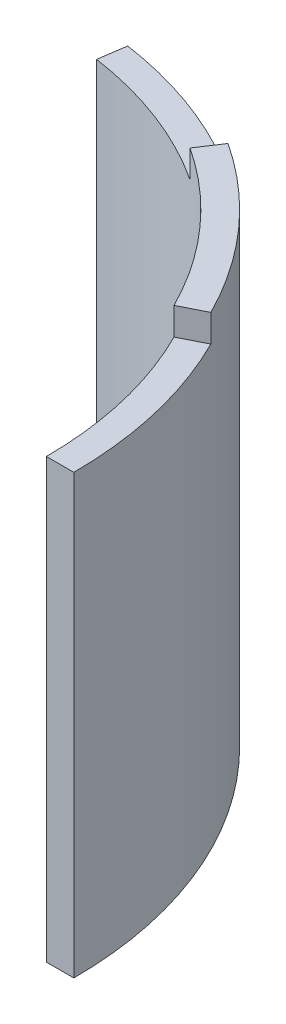
ISO-10303-21;
HEADER;
FILE_DESCRIPTION(('STEP AP214'),'2;1');
FILE_NAME('part.step','',(''),(''),'','','');
FILE_SCHEMA(('AUTOMOTIVE_DESIGN { 1 0 10303 214 1 1 1 1 }'));
ENDSEC;
DATA;
#1=APPLICATION_CONTEXT('core data for automotive mechanical design processes');
#2=APPLICATION_PROTOCOL_DEFINITION('international standard','automotive_design',2000,#1);
#3=PRODUCT_CONTEXT('',#1,'mechanical');
#4=PRODUCT('Part','Part','',(#3));
#5=PRODUCT_RELATED_PRODUCT_CATEGORY('part','',(#4));
#6=PRODUCT_DEFINITION_FORMATION('','',#4);
#7=PRODUCT_DEFINITION_CONTEXT('part definition',#1,'design');
#8=PRODUCT_DEFINITION('design','',#6,#7);
#9=PRODUCT_DEFINITION_SHAPE('','',#8);
#10=(LENGTH_UNIT() NAMED_UNIT(*) SI_UNIT(.MILLI.,.METRE.));
#11=(NAMED_UNIT(*) PLANE_ANGLE_UNIT() SI_UNIT($,.RADIAN.));
#12=(NAMED_UNIT(*) SI_UNIT($,.STERADIAN.) SOLID_ANGLE_UNIT());
#13=UNCERTAINTY_MEASURE_WITH_UNIT(LENGTH_MEASURE(1.E-05),#10,'distance_accuracy_value','');
#14=(GEOMETRIC_REPRESENTATION_CONTEXT(3) GLOBAL_UNCERTAINTY_ASSIGNED_CONTEXT((#13)) GLOBAL_UNIT_ASSIGNED_CONTEXT((#10,
#11,#12)) REPRESENTATION_CONTEXT('',''));
#15=CARTESIAN_POINT('',(0.,0.,0.));
#16=DIRECTION('',(0.,0.,1.));
#17=DIRECTION('',(1.,0.,0.));
#18=AXIS2_PLACEMENT_3D('',#15,#16,#17);
#19=CARTESIAN_POINT('',(0.,25.3500001,0.));
#20=DIRECTION('',(0.,1.,0.));
#21=DIRECTION('',(0.,0.,1.));
#22=AXIS2_PLACEMENT_3D('',#19,#20,#21);
#23=PLANE('',#22);
#24=DIRECTION('',(0.893841424151262,0.,-0.448383216090035));
#25=VECTOR('',#24,1.);
#26=CARTESIAN_POINT('',(41.4340192165318,25.3500001,-20.7848039818536));
#27=LINE('',#26,#25);
#28=CARTESIAN_POINT('',(38.5960726948515,25.3500001,-19.3611872707677));
#29=VERTEX_POINT('',#28);
#30=CARTESIAN_POINT('',(41.4340192165318,25.3500001,-20.7848039818536));
#31=VERTEX_POINT('',#30);
#32=EDGE_CURVE('E126',#29,#31,#27,.T.);
#33=ORIENTED_EDGE('',*,*,#32,.F.);
#34=CARTESIAN_POINT('',(0.,25.3500001,0.));
#35=DIRECTION('',(0.,-1.,0.));
#36=DIRECTION('',(0.,0.,1.));
#37=AXIS2_PLACEMENT_3D('',#34,#35,#36);
#38=CIRCLE('',#37,43.18);
#39=CARTESIAN_POINT('',(43.18,25.3500001,0.));
#40=VERTEX_POINT('',#39);
#41=EDGE_CURVE('E147',#29,#40,#38,.T.);
#42=ORIENTED_EDGE('',*,*,#41,.T.);
#43=DIRECTION('',(1.,0.,0.));
#44=VECTOR('',#43,1.);
#45=CARTESIAN_POINT('',(43.18,25.3500001,0.));
#46=LINE('',#45,#44);
#47=CARTESIAN_POINT('',(46.355,25.3500001,0.));
#48=VERTEX_POINT('',#47);
#49=EDGE_CURVE('E146',#40,#48,#46,.T.);
#50=ORIENTED_EDGE('',*,*,#49,.T.);
#51=CARTESIAN_POINT('',(0.,25.3500001,0.));
#52=DIRECTION('',(0.,1.,0.));
#53=DIRECTION('',(0.,0.,1.));
#54=AXIS2_PLACEMENT_3D('',#51,#52,#53);
#55=CIRCLE('',#54,46.355);
#56=EDGE_CURVE('E63',#48,#31,#55,.T.);
#57=ORIENTED_EDGE('',*,*,#56,.T.);
#58=EDGE_LOOP('',(#33,#42,#50,#57));
#59=FACE_BOUND('',#58,.T.);
#60=ADVANCED_FACE('F39',(#59),#23,.T.);
#61=CARTESIAN_POINT('',(0.,25.3500001,0.));
#62=DIRECTION('',(0.,-1.,0.));
#63=DIRECTION('',(0.,0.,-1.));
#64=AXIS2_PLACEMENT_3D('',#61,#62,#63);
#65=CYLINDRICAL_SURFACE('',#64,43.18);
#66=CARTESIAN_POINT('',(0.,-25.3500001,0.));
#67=DIRECTION('',(0.,-1.,0.));
#68=DIRECTION('',(0.,0.,1.));
#69=AXIS2_PLACEMENT_3D('',#66,#67,#68);
#70=CIRCLE('',#69,43.18);
#71=CARTESIAN_POINT('',(6.27804170074743,-25.3500001,-42.7211726478063));
#72=VERTEX_POINT('',#71);
#73=CARTESIAN_POINT('',(43.18,-25.3500001,0.));
#74=VERTEX_POINT('',#73);
#75=EDGE_CURVE('E132',#72,#74,#70,.T.);
#76=ORIENTED_EDGE('',*,*,#75,.T.);
#77=DIRECTION('',(0.,-1.,0.));
#78=VECTOR('',#77,1.);
#79=CARTESIAN_POINT('',(43.18,25.3500001,0.));
#80=LINE('',#79,#78);
#81=EDGE_CURVE('E11',#40,#74,#80,.T.);
#82=ORIENTED_EDGE('',*,*,#81,.F.);
#83=ORIENTED_EDGE('',*,*,#41,.F.);
#84=DIRECTION('',(0.,-1.,0.));
#85=VECTOR('',#84,1.);
#86=CARTESIAN_POINT('',(38.5960726948515,28.5250001,-19.3611872707677));
#87=LINE('',#86,#85);
#88=CARTESIAN_POINT('',(38.5960726948515,28.5250001,-19.3611872707677));
#89=VERTEX_POINT('',#88);
#90=EDGE_CURVE('E139',#89,#29,#87,.T.);
#91=ORIENTED_EDGE('',*,*,#90,.F.);
#92=CARTESIAN_POINT('',(0.,28.5250001,0.));
#93=DIRECTION('',(0.,-1.,0.));
#94=DIRECTION('',(0.,0.,1.));
#95=AXIS2_PLACEMENT_3D('',#92,#93,#94);
#96=CIRCLE('',#95,43.18);
#97=CARTESIAN_POINT('',(23.7445858046684,28.5250001,-36.0653163713385));
#98=VERTEX_POINT('',#97);
#99=EDGE_CURVE('E115',#98,#89,#96,.T.);
#100=ORIENTED_EDGE('',*,*,#99,.F.);
#101=DIRECTION('',(0.,-1.,0.));
#102=VECTOR('',#101,1.);
#103=CARTESIAN_POINT('',(23.7445858046684,28.5250001,-36.0653163713385));
#104=LINE('',#103,#102);
#105=CARTESIAN_POINT('',(23.7445858046684,25.3500001,-36.0653163713385));
#106=VERTEX_POINT('',#105);
#107=EDGE_CURVE('E111',#98,#106,#104,.T.);
#108=ORIENTED_EDGE('',*,*,#107,.T.);
#109=CARTESIAN_POINT('',(6.27804170074743,25.3500001,-42.7211726478063));
#110=VERTEX_POINT('',#109);
#111=EDGE_CURVE('E143',#110,#106,#38,.T.);
#112=ORIENTED_EDGE('',*,*,#111,.F.);
#113=DIRECTION('',(0.,-1.,0.));
#114=VECTOR('',#113,1.);
#115=CARTESIAN_POINT('',(6.27804170074743,25.3500001,-42.7211726478063));
#116=LINE('',#115,#114);
#117=EDGE_CURVE('E154',#110,#72,#116,.T.);
#118=ORIENTED_EDGE('',*,*,#117,.T.);
#119=EDGE_LOOP('',(#76,#82,#83,#91,#100,#108,#112,#118));
#120=FACE_BOUND('',#119,.T.);
#121=ADVANCED_FACE('F41',(#120),#65,.F.);
#122=CARTESIAN_POINT('',(43.18,25.3500001,0.));
#123=DIRECTION('',(0.,0.,-1.));
#124=DIRECTION('',(-1.,0.,0.));
#125=AXIS2_PLACEMENT_3D('',#122,#123,#124);
#126=PLANE('',#125);
#127=DIRECTION('',(1.,0.,0.));
#128=VECTOR('',#127,1.);
#129=CARTESIAN_POINT('',(43.18,-25.3500001,0.));
#130=LINE('',#129,#128);
#131=CARTESIAN_POINT('',(46.355,-25.3500001,0.));
#132=VERTEX_POINT('',#131);
#133=EDGE_CURVE('E137',#74,#132,#130,.T.);
#134=ORIENTED_EDGE('',*,*,#133,.T.);
#135=DIRECTION('',(0.,-1.,0.));
#136=VECTOR('',#135,1.);
#137=CARTESIAN_POINT('',(46.355,25.3500001,0.));
#138=LINE('',#137,#136);
#139=EDGE_CURVE('E48',#48,#132,#138,.T.);
#140=ORIENTED_EDGE('',*,*,#139,.F.);
#141=ORIENTED_EDGE('',*,*,#49,.F.);
#142=ORIENTED_EDGE('',*,*,#81,.T.);
#143=EDGE_LOOP('',(#134,#140,#141,#142));
#144=FACE_BOUND('',#143,.T.);
#145=ADVANCED_FACE('F205',(#144),#126,.F.);
#146=CARTESIAN_POINT('',(0.,25.3500001,0.));
#147=DIRECTION('',(0.,-1.,0.));
#148=DIRECTION('',(0.,0.,-1.));
#149=AXIS2_PLACEMENT_3D('',#146,#147,#148);
#150=CYLINDRICAL_SURFACE('',#149,46.355);
#151=CARTESIAN_POINT('',(0.,-25.3500001,0.));
#152=DIRECTION('',(0.,1.,0.));
#153=DIRECTION('',(0.,0.,1.));
#154=AXIS2_PLACEMENT_3D('',#151,#152,#153);
#155=CIRCLE('',#154,46.355);
#156=CARTESIAN_POINT('',(6.73966241403768,-25.3500001,-45.862435342498));
#157=VERTEX_POINT('',#156);
#158=EDGE_CURVE('E158',#132,#157,#155,.T.);
#159=ORIENTED_EDGE('',*,*,#158,.T.);
#160=DIRECTION('',(0.,-1.,0.));
#161=VECTOR('',#160,1.);
#162=CARTESIAN_POINT('',(6.73966241403768,25.3500001,-45.862435342498));
#163=LINE('',#162,#161);
#164=CARTESIAN_POINT('',(6.73966241403768,25.3500001,-45.862435342498));
#165=VERTEX_POINT('',#164);
#166=EDGE_CURVE('E167',#165,#157,#163,.T.);
#167=ORIENTED_EDGE('',*,*,#166,.F.);
#168=CARTESIAN_POINT('',(25.4905112314823,25.3500001,-38.7171778692311));
#169=VERTEX_POINT('',#168);
#170=EDGE_CURVE('E130',#169,#165,#55,.T.);
#171=ORIENTED_EDGE('',*,*,#170,.F.);
#172=DIRECTION('',(0.,-1.,0.));
#173=VECTOR('',#172,1.);
#174=CARTESIAN_POINT('',(25.4905112314823,28.5250001,-38.7171778692311));
#175=LINE('',#174,#173);
#176=CARTESIAN_POINT('',(25.4905112314823,28.5250001,-38.7171778692311));
#177=VERTEX_POINT('',#176);
#178=EDGE_CURVE('E109',#177,#169,#175,.T.);
#179=ORIENTED_EDGE('',*,*,#178,.F.);
#180=CARTESIAN_POINT('',(0.,28.5250001,0.));
#181=DIRECTION('',(0.,1.,0.));
#182=DIRECTION('',(0.,0.,1.));
#183=AXIS2_PLACEMENT_3D('',#180,#181,#182);
#184=CIRCLE('',#183,46.355);
#185=CARTESIAN_POINT('',(41.4340192165318,28.5250001,-20.7848039818536));
#186=VERTEX_POINT('',#185);
#187=EDGE_CURVE('E116',#186,#177,#184,.T.);
#188=ORIENTED_EDGE('',*,*,#187,.F.);
#189=DIRECTION('',(0.,-1.,0.));
#190=VECTOR('',#189,1.);
#191=CARTESIAN_POINT('',(41.4340192165318,28.5250001,-20.7848039818536));
#192=LINE('',#191,#190);
#193=EDGE_CURVE('E195',#186,#31,#192,.T.);
#194=ORIENTED_EDGE('',*,*,#193,.T.);
#195=ORIENTED_EDGE('',*,*,#56,.F.);
#196=ORIENTED_EDGE('',*,*,#139,.T.);
#197=EDGE_LOOP('',(#159,#167,#171,#179,#188,#194,#195,#196));
#198=FACE_BOUND('',#197,.T.);
#199=ADVANCED_FACE('F128',(#198),#150,.T.);
#200=CARTESIAN_POINT('',(6.27804170074743,25.3500001,-42.7211726478063));
#201=DIRECTION('',(0.989374077068234,0.,0.1453923506426));
#202=DIRECTION('',(0.1453923506426,0.,-0.989374077068234));
#203=AXIS2_PLACEMENT_3D('',#200,#201,#202);
#204=PLANE('',#203);
#205=DIRECTION('',(-0.1453923506426,0.,0.989374077068234));
#206=VECTOR('',#205,1.);
#207=CARTESIAN_POINT('',(6.27804170074743,-25.3500001,-42.7211726478063));
#208=LINE('',#207,#206);
#209=EDGE_CURVE('E161',#157,#72,#208,.T.);
#210=ORIENTED_EDGE('',*,*,#209,.T.);
#211=ORIENTED_EDGE('',*,*,#117,.F.);
#212=DIRECTION('',(-0.1453923506426,0.,0.989374077068234));
#213=VECTOR('',#212,1.);
#214=CARTESIAN_POINT('',(6.27804170074743,25.3500001,-42.7211726478063));
#215=LINE('',#214,#213);
#216=EDGE_CURVE('E152',#165,#110,#215,.T.);
#217=ORIENTED_EDGE('',*,*,#216,.F.);
#218=ORIENTED_EDGE('',*,*,#166,.T.);
#219=EDGE_LOOP('',(#210,#211,#217,#218));
#220=FACE_BOUND('',#219,.T.);
#221=ADVANCED_FACE('F182',(#220),#204,.F.);
#222=DIRECTION('',(-0.549897772224835,0.,0.83523196784017));
#223=VECTOR('',#222,1.);
#224=CARTESIAN_POINT('',(25.4905112314823,25.3500001,-38.7171778692311));
#225=LINE('',#224,#223);
#226=EDGE_CURVE('E55',#169,#106,#225,.T.);
#227=ORIENTED_EDGE('',*,*,#226,.F.);
#228=ORIENTED_EDGE('',*,*,#170,.T.);
#229=ORIENTED_EDGE('',*,*,#216,.T.);
#230=ORIENTED_EDGE('',*,*,#111,.T.);
#231=EDGE_LOOP('',(#227,#228,#229,#230));
#232=FACE_BOUND('',#231,.T.);
#233=ADVANCED_FACE('F187',(#232),#23,.T.);
#234=CARTESIAN_POINT('',(0.,-25.3500001,0.));
#235=DIRECTION('',(0.,1.,0.));
#236=DIRECTION('',(0.,0.,1.));
#237=AXIS2_PLACEMENT_3D('',#234,#235,#236);
#238=PLANE('',#237);
#239=ORIENTED_EDGE('',*,*,#75,.F.);
#240=ORIENTED_EDGE('',*,*,#209,.F.);
#241=ORIENTED_EDGE('',*,*,#158,.F.);
#242=ORIENTED_EDGE('',*,*,#133,.F.);
#243=EDGE_LOOP('',(#239,#240,#241,#242));
#244=FACE_BOUND('',#243,.T.);
#245=ADVANCED_FACE('F179',(#244),#238,.F.);
#246=CARTESIAN_POINT('',(25.4905112314823,28.5250001,-38.7171778692311));
#247=DIRECTION('',(0.83523196784017,0.,0.549897772224835));
#248=DIRECTION('',(0.549897772224835,0.,-0.83523196784017));
#249=AXIS2_PLACEMENT_3D('',#246,#247,#248);
#250=PLANE('',#249);
#251=ORIENTED_EDGE('',*,*,#226,.T.);
#252=ORIENTED_EDGE('',*,*,#107,.F.);
#253=DIRECTION('',(-0.549897772224835,0.,0.83523196784017));
#254=VECTOR('',#253,1.);
#255=CARTESIAN_POINT('',(25.4905112314823,28.5250001,-38.7171778692311));
#256=LINE('',#255,#254);
#257=EDGE_CURVE('E105',#177,#98,#256,.T.);
#258=ORIENTED_EDGE('',*,*,#257,.F.);
#259=ORIENTED_EDGE('',*,*,#178,.T.);
#260=EDGE_LOOP('',(#251,#252,#258,#259));
#261=FACE_BOUND('',#260,.T.);
#262=ADVANCED_FACE('F107',(#261),#250,.F.);
#263=CARTESIAN_POINT('',(41.4340192165318,28.5250001,-20.7848039818536));
#264=DIRECTION('',(-0.448383216090035,0.,-0.893841424151262));
#265=DIRECTION('',(-0.893841424151262,0.,0.448383216090035));
#266=AXIS2_PLACEMENT_3D('',#263,#264,#265);
#267=PLANE('',#266);
#268=ORIENTED_EDGE('',*,*,#32,.T.);
#269=ORIENTED_EDGE('',*,*,#193,.F.);
#270=DIRECTION('',(0.893841424151262,0.,-0.448383216090035));
#271=VECTOR('',#270,1.);
#272=CARTESIAN_POINT('',(41.4340192165318,28.5250001,-20.7848039818536));
#273=LINE('',#272,#271);
#274=EDGE_CURVE('E121',#89,#186,#273,.T.);
#275=ORIENTED_EDGE('',*,*,#274,.F.);
#276=ORIENTED_EDGE('',*,*,#90,.T.);
#277=EDGE_LOOP('',(#268,#269,#275,#276));
#278=FACE_BOUND('',#277,.T.);
#279=ADVANCED_FACE('F201',(#278),#267,.F.);
#280=CARTESIAN_POINT('',(0.,28.5250001,0.));
#281=DIRECTION('',(0.,1.,0.));
#282=DIRECTION('',(0.,0.,1.));
#283=AXIS2_PLACEMENT_3D('',#280,#281,#282);
#284=PLANE('',#283);
#285=ORIENTED_EDGE('',*,*,#187,.T.);
#286=ORIENTED_EDGE('',*,*,#257,.T.);
#287=ORIENTED_EDGE('',*,*,#99,.T.);
#288=ORIENTED_EDGE('',*,*,#274,.T.);
#289=EDGE_LOOP('',(#285,#286,#287,#288));
#290=FACE_BOUND('',#289,.T.);
#291=ADVANCED_FACE('F119',(#290),#284,.T.);
#292=CLOSED_SHELL('',(#60,#121,#145,#199,#221,#233,#245,#262,#279,#291));
#293=MANIFOLD_SOLID_BREP('B2',#292);
#294=ADVANCED_BREP_SHAPE_REPRESENTATION('',(#18,#293),#14);
#295=SHAPE_DEFINITION_REPRESENTATION(#9,#294);
ENDSEC;
END-ISO-10303-21;
